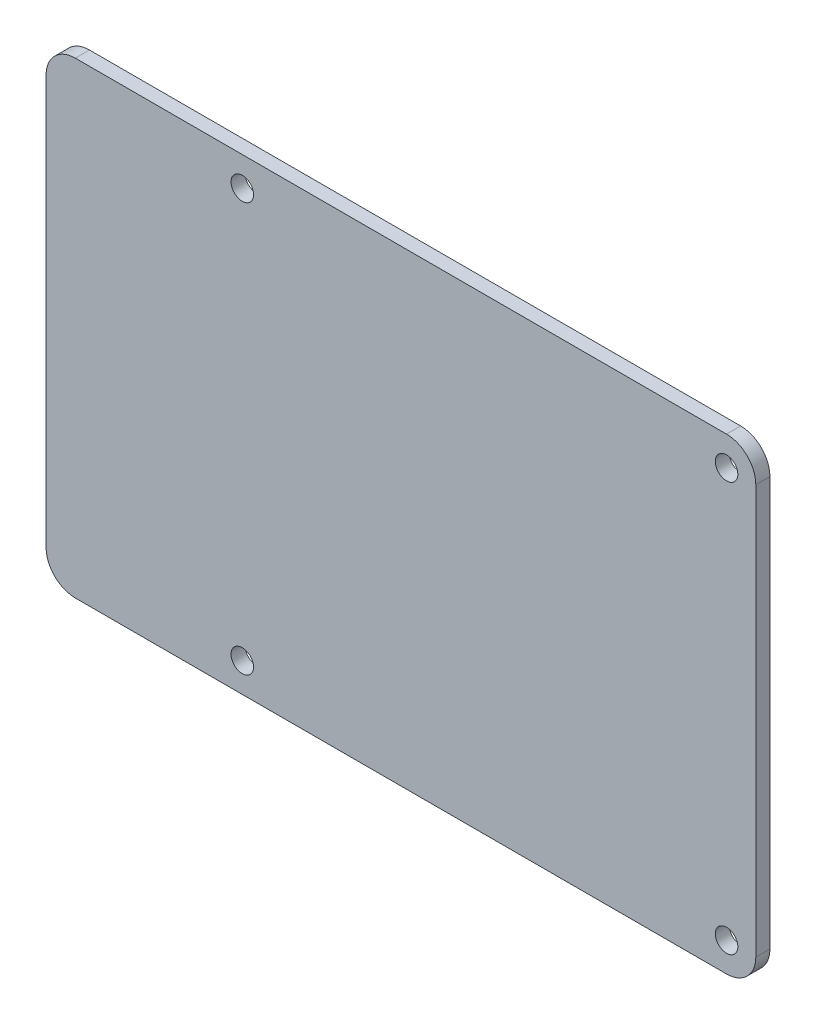
ISO-10303-21;
HEADER;
FILE_DESCRIPTION(('STEP AP214'),'2;1');
FILE_NAME('part.step','',(''),(''),'','','');
FILE_SCHEMA(('AUTOMOTIVE_DESIGN { 1 0 10303 214 1 1 1 1 }'));
ENDSEC;
DATA;
#1=APPLICATION_CONTEXT('core data for automotive mechanical design processes');
#2=APPLICATION_PROTOCOL_DEFINITION('international standard','automotive_design',2000,#1);
#3=PRODUCT_CONTEXT('',#1,'mechanical');
#4=PRODUCT('Part','Part','',(#3));
#5=PRODUCT_RELATED_PRODUCT_CATEGORY('part','',(#4));
#6=PRODUCT_DEFINITION_FORMATION('','',#4);
#7=PRODUCT_DEFINITION_CONTEXT('part definition',#1,'design');
#8=PRODUCT_DEFINITION('design','',#6,#7);
#9=PRODUCT_DEFINITION_SHAPE('','',#8);
#10=(LENGTH_UNIT() NAMED_UNIT(*) SI_UNIT(.MILLI.,.METRE.));
#11=(NAMED_UNIT(*) PLANE_ANGLE_UNIT() SI_UNIT($,.RADIAN.));
#12=(NAMED_UNIT(*) SI_UNIT($,.STERADIAN.) SOLID_ANGLE_UNIT());
#13=UNCERTAINTY_MEASURE_WITH_UNIT(LENGTH_MEASURE(1.E-05),#10,'distance_accuracy_value','');
#14=(GEOMETRIC_REPRESENTATION_CONTEXT(3) GLOBAL_UNCERTAINTY_ASSIGNED_CONTEXT((#13)) GLOBAL_UNIT_ASSIGNED_CONTEXT((#10,
#11,#12)) REPRESENTATION_CONTEXT('',''));
#15=CARTESIAN_POINT('',(0.,0.,0.));
#16=DIRECTION('',(0.,0.,1.));
#17=DIRECTION('',(1.,0.,0.));
#18=AXIS2_PLACEMENT_3D('',#15,#16,#17);
#19=CARTESIAN_POINT('',(-0.001000000047498,3.5,0.));
#20=DIRECTION('',(0.,0.,-1.));
#21=DIRECTION('',(-1.,0.,0.));
#22=AXIS2_PLACEMENT_3D('',#19,#20,#21);
#23=PLANE('',#22);
#24=DIRECTION('',(-1.,0.,0.));
#25=VECTOR('',#24,1.);
#26=CARTESIAN_POINT('',(-0.001000000047498,0.,0.));
#27=LINE('',#26,#25);
#28=CARTESIAN_POINT('',(3.499000072479,2.54570670099596E-13,0.));
#29=VERTEX_POINT('',#28);
#30=CARTESIAN_POINT('',(81.499000549316,0.,0.));
#31=VERTEX_POINT('',#30);
#32=EDGE_CURVE('E125',#29,#31,#27,.F.);
#33=ORIENTED_EDGE('',*,*,#32,.T.);
#34=CARTESIAN_POINT('',(81.499429020422,3.499571528894,0.));
#35=DIRECTION('',(0.,0.,-1.));
#36=DIRECTION('',(-1.,0.,0.));
#37=AXIS2_PLACEMENT_3D('',#34,#35,#36);
#38=CIRCLE('',#37,3.499571555124);
#39=CARTESIAN_POINT('',(84.999000549316,3.5,0.));
#40=VERTEX_POINT('',#39);
#41=EDGE_CURVE('E128',#40,#31,#38,.T.);
#42=ORIENTED_EDGE('',*,*,#41,.F.);
#43=DIRECTION('',(0.,1.,0.));
#44=VECTOR('',#43,1.);
#45=CARTESIAN_POINT('',(84.999000549316,3.5,0.));
#46=LINE('',#45,#44);
#47=CARTESIAN_POINT('',(84.999000549316,52.5,0.));
#48=VERTEX_POINT('',#47);
#49=EDGE_CURVE('E132',#40,#48,#46,.T.);
#50=ORIENTED_EDGE('',*,*,#49,.T.);
#51=CARTESIAN_POINT('',(81.499426375662,52.500425826346,0.));
#52=DIRECTION('',(0.,0.,-1.));
#53=DIRECTION('',(-1.,0.,0.));
#54=AXIS2_PLACEMENT_3D('',#51,#52,#53);
#55=CIRCLE('',#54,3.499574199561);
#56=CARTESIAN_POINT('',(81.499000549316,55.9999999999999,0.));
#57=VERTEX_POINT('',#56);
#58=EDGE_CURVE('E135',#57,#48,#55,.T.);
#59=ORIENTED_EDGE('',*,*,#58,.F.);
#60=DIRECTION('',(-1.,0.,0.));
#61=VECTOR('',#60,1.);
#62=CARTESIAN_POINT('',(-0.001000000047498,56.,0.));
#63=LINE('',#62,#61);
#64=CARTESIAN_POINT('',(3.499000072479,56.,0.));
#65=VERTEX_POINT('',#64);
#66=EDGE_CURVE('E94',#57,#65,#63,.T.);
#67=ORIENTED_EDGE('',*,*,#66,.T.);
#68=CARTESIAN_POINT('',(3.498571652636,52.500428347325,0.));
#69=DIRECTION('',(0.,0.,-1.));
#70=DIRECTION('',(-1.,0.,0.));
#71=AXIS2_PLACEMENT_3D('',#68,#69,#70);
#72=CIRCLE('',#71,3.499571678899);
#73=CARTESIAN_POINT('',(-0.00100000004782833,52.5,0.));
#74=VERTEX_POINT('',#73);
#75=EDGE_CURVE('E91',#74,#65,#72,.T.);
#76=ORIENTED_EDGE('',*,*,#75,.F.);
#77=DIRECTION('',(0.,1.,0.));
#78=VECTOR('',#77,1.);
#79=CARTESIAN_POINT('',(-0.001000000047498,3.5,0.));
#80=LINE('',#79,#78);
#81=CARTESIAN_POINT('',(-0.00100000004745992,3.5,0.));
#82=VERTEX_POINT('',#81);
#83=EDGE_CURVE('E20',#74,#82,#80,.F.);
#84=ORIENTED_EDGE('',*,*,#83,.T.);
#85=CARTESIAN_POINT('',(3.498569007882,3.499569007921,0.));
#86=DIRECTION('',(0.,0.,-1.));
#87=DIRECTION('',(-1.,0.,0.));
#88=AXIS2_PLACEMENT_3D('',#85,#86,#87);
#89=CIRCLE('',#88,3.499569034469);
#90=EDGE_CURVE('E123',#29,#82,#89,.T.);
#91=ORIENTED_EDGE('',*,*,#90,.F.);
#92=EDGE_LOOP('',(#33,#42,#50,#59,#67,#76,#84,#91));
#93=FACE_BOUND('',#92,.T.);
#94=CARTESIAN_POINT('',(81.499000549316,3.5,0.));
#95=DIRECTION('',(0.,0.,1.));
#96=DIRECTION('',(1.,0.,0.));
#97=AXIS2_PLACEMENT_3D('',#94,#95,#96);
#98=CIRCLE('',#97,1.35000000000001);
#99=CARTESIAN_POINT('',(82.849000549316,3.5,0.));
#100=VERTEX_POINT('',#99);
#101=EDGE_CURVE('E152',#100,#100,#98,.T.);
#102=ORIENTED_EDGE('',*,*,#101,.F.);
#103=EDGE_LOOP('',(#102));
#104=FACE_BOUND('',#103,.T.);
#105=CARTESIAN_POINT('',(23.499000549316,3.49999999999959,0.));
#106=DIRECTION('',(0.,0.,1.));
#107=DIRECTION('',(1.,0.,0.));
#108=AXIS2_PLACEMENT_3D('',#105,#106,#107);
#109=CIRCLE('',#108,1.35000000000001);
#110=CARTESIAN_POINT('',(24.849000549316,3.49999999999959,0.));
#111=VERTEX_POINT('',#110);
#112=EDGE_CURVE('E158',#111,#111,#109,.T.);
#113=ORIENTED_EDGE('',*,*,#112,.F.);
#114=EDGE_LOOP('',(#113));
#115=FACE_BOUND('',#114,.T.);
#116=CARTESIAN_POINT('',(23.4990005493158,52.4999999999996,0.));
#117=DIRECTION('',(0.,0.,1.));
#118=DIRECTION('',(1.,0.,0.));
#119=AXIS2_PLACEMENT_3D('',#116,#117,#118);
#120=CIRCLE('',#119,1.35);
#121=CARTESIAN_POINT('',(24.8490005493158,52.4999999999996,0.));
#122=VERTEX_POINT('',#121);
#123=EDGE_CURVE('E164',#122,#122,#120,.T.);
#124=ORIENTED_EDGE('',*,*,#123,.F.);
#125=EDGE_LOOP('',(#124));
#126=FACE_BOUND('',#125,.T.);
#127=CARTESIAN_POINT('',(81.4990005493158,52.5,0.));
#128=DIRECTION('',(0.,0.,1.));
#129=DIRECTION('',(1.,0.,0.));
#130=AXIS2_PLACEMENT_3D('',#127,#128,#129);
#131=CIRCLE('',#130,1.35);
#132=CARTESIAN_POINT('',(82.8490005493158,52.5,0.));
#133=VERTEX_POINT('',#132);
#134=EDGE_CURVE('E170',#133,#133,#131,.T.);
#135=ORIENTED_EDGE('',*,*,#134,.F.);
#136=EDGE_LOOP('',(#135));
#137=FACE_BOUND('',#136,.T.);
#138=ADVANCED_FACE('F17',(#93,#104,#115,#126,#137),#23,.F.);
#139=CARTESIAN_POINT('',(-0.001000000047497,52.5,-1.69143934));
#140=DIRECTION('',(1.,0.,0.));
#141=DIRECTION('',(0.,0.,-1.));
#142=AXIS2_PLACEMENT_3D('',#139,#140,#141);
#143=PLANE('',#142);
#144=DIRECTION('',(0.,0.,-1.));
#145=VECTOR('',#144,1.);
#146=CARTESIAN_POINT('',(-0.00100000004742183,3.5,-1.69143934));
#147=LINE('',#146,#145);
#148=CARTESIAN_POINT('',(-0.00100000004745992,3.5,-1.69143934));
#149=VERTEX_POINT('',#148);
#150=EDGE_CURVE('E85',#82,#149,#147,.T.);
#151=ORIENTED_EDGE('',*,*,#150,.F.);
#152=ORIENTED_EDGE('',*,*,#83,.F.);
#153=DIRECTION('',(0.,0.,-1.));
#154=VECTOR('',#153,1.);
#155=CARTESIAN_POINT('',(-0.00100000004815866,52.5,-1.69143934));
#156=LINE('',#155,#154);
#157=CARTESIAN_POINT('',(-0.00100000004799349,52.5,-1.69143934));
#158=VERTEX_POINT('',#157);
#159=EDGE_CURVE('E82',#158,#74,#156,.F.);
#160=ORIENTED_EDGE('',*,*,#159,.F.);
#161=DIRECTION('',(0.,1.,0.));
#162=VECTOR('',#161,1.);
#163=CARTESIAN_POINT('',(-0.001000000047498,3.5,-1.69143934));
#164=LINE('',#163,#162);
#165=EDGE_CURVE('E121',#149,#158,#164,.T.);
#166=ORIENTED_EDGE('',*,*,#165,.F.);
#167=EDGE_LOOP('',(#151,#152,#160,#166));
#168=FACE_BOUND('',#167,.T.);
#169=ADVANCED_FACE('F80',(#168),#143,.F.);
#170=CARTESIAN_POINT('',(3.498571652636,52.500428347325,-1.69143934));
#171=DIRECTION('',(0.,0.,-1.));
#172=DIRECTION('',(-1.,0.,0.));
#173=AXIS2_PLACEMENT_3D('',#170,#171,#172);
#174=CYLINDRICAL_SURFACE('',#173,3.499571678899);
#175=ORIENTED_EDGE('',*,*,#75,.T.);
#176=DIRECTION('',(0.,0.,-1.));
#177=VECTOR('',#176,1.);
#178=CARTESIAN_POINT('',(3.499000072479,56.,-1.69143934));
#179=LINE('',#178,#177);
#180=CARTESIAN_POINT('',(3.499000072479,56.,-1.69143934));
#181=VERTEX_POINT('',#180);
#182=EDGE_CURVE('E103',#65,#181,#179,.T.);
#183=ORIENTED_EDGE('',*,*,#182,.T.);
#184=CARTESIAN_POINT('',(3.498571652636,52.500428347325,-1.69143934));
#185=DIRECTION('',(0.,0.,-1.));
#186=DIRECTION('',(-1.,0.,0.));
#187=AXIS2_PLACEMENT_3D('',#184,#185,#186);
#188=CIRCLE('',#187,3.499571678899);
#189=EDGE_CURVE('E99',#158,#181,#188,.T.);
#190=ORIENTED_EDGE('',*,*,#189,.F.);
#191=ORIENTED_EDGE('',*,*,#159,.T.);
#192=EDGE_LOOP('',(#175,#183,#190,#191));
#193=FACE_BOUND('',#192,.T.);
#194=ADVANCED_FACE('F97',(#193),#174,.T.);
#195=CARTESIAN_POINT('',(81.499000549316,56.,-1.69143934));
#196=DIRECTION('',(0.,-1.,0.));
#197=DIRECTION('',(0.,0.,-1.));
#198=AXIS2_PLACEMENT_3D('',#195,#196,#197);
#199=PLANE('',#198);
#200=ORIENTED_EDGE('',*,*,#182,.F.);
#201=ORIENTED_EDGE('',*,*,#66,.F.);
#202=DIRECTION('',(0.,0.,-1.));
#203=VECTOR('',#202,1.);
#204=CARTESIAN_POINT('',(81.499000549316,55.9999999999998,-1.69143934));
#205=LINE('',#204,#203);
#206=CARTESIAN_POINT('',(81.499000549316,55.9999999999999,-1.69143934));
#207=VERTEX_POINT('',#206);
#208=EDGE_CURVE('E138',#207,#57,#205,.F.);
#209=ORIENTED_EDGE('',*,*,#208,.F.);
#210=DIRECTION('',(-1.,0.,0.));
#211=VECTOR('',#210,1.);
#212=CARTESIAN_POINT('',(-0.001000000047498,56.,-1.69143934));
#213=LINE('',#212,#211);
#214=EDGE_CURVE('E117',#181,#207,#213,.F.);
#215=ORIENTED_EDGE('',*,*,#214,.F.);
#216=EDGE_LOOP('',(#200,#201,#209,#215));
#217=FACE_BOUND('',#216,.T.);
#218=ADVANCED_FACE('F214',(#217),#199,.F.);
#219=CARTESIAN_POINT('',(81.499426375662,52.500425826346,-1.69143934));
#220=DIRECTION('',(0.,0.,-1.));
#221=DIRECTION('',(-1.,0.,0.));
#222=AXIS2_PLACEMENT_3D('',#219,#220,#221);
#223=CYLINDRICAL_SURFACE('',#222,3.499574199561);
#224=ORIENTED_EDGE('',*,*,#58,.T.);
#225=DIRECTION('',(0.,0.,1.));
#226=VECTOR('',#225,1.);
#227=CARTESIAN_POINT('',(84.999000549316,52.5,-1.69143934));
#228=LINE('',#227,#226);
#229=CARTESIAN_POINT('',(84.999000549316,52.5,-1.69143934));
#230=VERTEX_POINT('',#229);
#231=EDGE_CURVE('E134',#48,#230,#228,.F.);
#232=ORIENTED_EDGE('',*,*,#231,.T.);
#233=CARTESIAN_POINT('',(81.499426375662,52.500425826346,-1.69143934));
#234=DIRECTION('',(0.,0.,-1.));
#235=DIRECTION('',(-1.,0.,0.));
#236=AXIS2_PLACEMENT_3D('',#233,#234,#235);
#237=CIRCLE('',#236,3.499574199561);
#238=EDGE_CURVE('E114',#207,#230,#237,.T.);
#239=ORIENTED_EDGE('',*,*,#238,.F.);
#240=ORIENTED_EDGE('',*,*,#208,.T.);
#241=EDGE_LOOP('',(#224,#232,#239,#240));
#242=FACE_BOUND('',#241,.T.);
#243=ADVANCED_FACE('F210',(#242),#223,.T.);
#244=CARTESIAN_POINT('',(84.999000549316,3.5,-1.69143934));
#245=DIRECTION('',(-1.,0.,0.));
#246=DIRECTION('',(0.,0.,1.));
#247=AXIS2_PLACEMENT_3D('',#244,#245,#246);
#248=PLANE('',#247);
#249=ORIENTED_EDGE('',*,*,#231,.F.);
#250=ORIENTED_EDGE('',*,*,#49,.F.);
#251=DIRECTION('',(0.,0.,-1.));
#252=VECTOR('',#251,1.);
#253=CARTESIAN_POINT('',(84.999000549316,3.5,-1.69143934));
#254=LINE('',#253,#252);
#255=CARTESIAN_POINT('',(84.999000549316,3.5,-1.69143934));
#256=VERTEX_POINT('',#255);
#257=EDGE_CURVE('E131',#256,#40,#254,.F.);
#258=ORIENTED_EDGE('',*,*,#257,.F.);
#259=DIRECTION('',(0.,1.,0.));
#260=VECTOR('',#259,1.);
#261=CARTESIAN_POINT('',(84.999000549316,3.5,-1.69143934));
#262=LINE('',#261,#260);
#263=EDGE_CURVE('E111',#230,#256,#262,.F.);
#264=ORIENTED_EDGE('',*,*,#263,.F.);
#265=EDGE_LOOP('',(#249,#250,#258,#264));
#266=FACE_BOUND('',#265,.T.);
#267=ADVANCED_FACE('F206',(#266),#248,.F.);
#268=CARTESIAN_POINT('',(81.499429020422,3.499571528894,-1.69143934));
#269=DIRECTION('',(0.,0.,-1.));
#270=DIRECTION('',(-1.,0.,0.));
#271=AXIS2_PLACEMENT_3D('',#268,#269,#270);
#272=CYLINDRICAL_SURFACE('',#271,3.499571555124);
#273=ORIENTED_EDGE('',*,*,#41,.T.);
#274=DIRECTION('',(0.,0.,1.));
#275=VECTOR('',#274,1.);
#276=CARTESIAN_POINT('',(81.499000549316,0.,-1.69143934));
#277=LINE('',#276,#275);
#278=CARTESIAN_POINT('',(81.499000549316,0.,-1.69143934));
#279=VERTEX_POINT('',#278);
#280=EDGE_CURVE('E127',#31,#279,#277,.F.);
#281=ORIENTED_EDGE('',*,*,#280,.T.);
#282=CARTESIAN_POINT('',(81.499429020422,3.499571528894,-1.69143934));
#283=DIRECTION('',(0.,0.,-1.));
#284=DIRECTION('',(-1.,0.,0.));
#285=AXIS2_PLACEMENT_3D('',#282,#283,#284);
#286=CIRCLE('',#285,3.499571555124);
#287=EDGE_CURVE('E108',#256,#279,#286,.T.);
#288=ORIENTED_EDGE('',*,*,#287,.F.);
#289=ORIENTED_EDGE('',*,*,#257,.T.);
#290=EDGE_LOOP('',(#273,#281,#288,#289));
#291=FACE_BOUND('',#290,.T.);
#292=ADVANCED_FACE('F203',(#291),#272,.T.);
#293=CARTESIAN_POINT('',(3.499000072479,0.,-1.69143934));
#294=DIRECTION('',(0.,1.,0.));
#295=DIRECTION('',(0.,0.,1.));
#296=AXIS2_PLACEMENT_3D('',#293,#294,#295);
#297=PLANE('',#296);
#298=ORIENTED_EDGE('',*,*,#280,.F.);
#299=ORIENTED_EDGE('',*,*,#32,.F.);
#300=DIRECTION('',(0.,0.,-1.));
#301=VECTOR('',#300,1.);
#302=CARTESIAN_POINT('',(3.499000072479,5.09575021068187E-13,-1.69143934));
#303=LINE('',#302,#301);
#304=CARTESIAN_POINT('',(3.499000072479,3.82072845583892E-13,-1.69143934));
#305=VERTEX_POINT('',#304);
#306=EDGE_CURVE('E35',#305,#29,#303,.F.);
#307=ORIENTED_EDGE('',*,*,#306,.F.);
#308=DIRECTION('',(-1.,0.,0.));
#309=VECTOR('',#308,1.);
#310=CARTESIAN_POINT('',(-0.001000000047498,0.,-1.69143934));
#311=LINE('',#310,#309);
#312=EDGE_CURVE('E26',#279,#305,#311,.T.);
#313=ORIENTED_EDGE('',*,*,#312,.F.);
#314=EDGE_LOOP('',(#298,#299,#307,#313));
#315=FACE_BOUND('',#314,.T.);
#316=ADVANCED_FACE('F195',(#315),#297,.F.);
#317=CARTESIAN_POINT('',(3.498569007882,3.499569007921,-1.69143934));
#318=DIRECTION('',(0.,0.,-1.));
#319=DIRECTION('',(-1.,0.,0.));
#320=AXIS2_PLACEMENT_3D('',#317,#318,#319);
#321=CYLINDRICAL_SURFACE('',#320,3.499569034469);
#322=ORIENTED_EDGE('',*,*,#90,.T.);
#323=ORIENTED_EDGE('',*,*,#150,.T.);
#324=CARTESIAN_POINT('',(3.498569007882,3.499569007921,-1.69143934));
#325=DIRECTION('',(0.,0.,-1.));
#326=DIRECTION('',(-1.,0.,0.));
#327=AXIS2_PLACEMENT_3D('',#324,#325,#326);
#328=CIRCLE('',#327,3.499569034469);
#329=EDGE_CURVE('E11',#305,#149,#328,.T.);
#330=ORIENTED_EDGE('',*,*,#329,.F.);
#331=ORIENTED_EDGE('',*,*,#306,.T.);
#332=EDGE_LOOP('',(#322,#323,#330,#331));
#333=FACE_BOUND('',#332,.T.);
#334=ADVANCED_FACE('F189',(#333),#321,.T.);
#335=CARTESIAN_POINT('',(-0.001000000047498,3.5,-1.69143934));
#336=DIRECTION('',(0.,0.,-1.));
#337=DIRECTION('',(-1.,0.,0.));
#338=AXIS2_PLACEMENT_3D('',#335,#336,#337);
#339=PLANE('',#338);
#340=ORIENTED_EDGE('',*,*,#312,.T.);
#341=ORIENTED_EDGE('',*,*,#329,.T.);
#342=ORIENTED_EDGE('',*,*,#165,.T.);
#343=ORIENTED_EDGE('',*,*,#189,.T.);
#344=ORIENTED_EDGE('',*,*,#214,.T.);
#345=ORIENTED_EDGE('',*,*,#238,.T.);
#346=ORIENTED_EDGE('',*,*,#263,.T.);
#347=ORIENTED_EDGE('',*,*,#287,.T.);
#348=EDGE_LOOP('',(#340,#341,#342,#343,#344,#345,#346,#347));
#349=FACE_BOUND('',#348,.T.);
#350=CARTESIAN_POINT('',(81.499000549316,3.5,-1.69143934));
#351=DIRECTION('',(0.,0.,-1.));
#352=DIRECTION('',(-1.,0.,0.));
#353=AXIS2_PLACEMENT_3D('',#350,#351,#352);
#354=CIRCLE('',#353,1.35000000000001);
#355=CARTESIAN_POINT('',(82.849000549316,3.5,-1.69143934));
#356=VERTEX_POINT('',#355);
#357=EDGE_CURVE('E89',#356,#356,#354,.F.);
#358=ORIENTED_EDGE('',*,*,#357,.T.);
#359=EDGE_LOOP('',(#358));
#360=FACE_BOUND('',#359,.T.);
#361=CARTESIAN_POINT('',(23.499000549316,3.49999999999959,-1.69143934));
#362=DIRECTION('',(0.,0.,-1.));
#363=DIRECTION('',(-1.,0.,0.));
#364=AXIS2_PLACEMENT_3D('',#361,#362,#363);
#365=CIRCLE('',#364,1.35000000000001);
#366=CARTESIAN_POINT('',(24.849000549316,3.49999999999959,-1.69143934));
#367=VERTEX_POINT('',#366);
#368=EDGE_CURVE('E155',#367,#367,#365,.F.);
#369=ORIENTED_EDGE('',*,*,#368,.T.);
#370=EDGE_LOOP('',(#369));
#371=FACE_BOUND('',#370,.T.);
#372=CARTESIAN_POINT('',(23.4990005493158,52.4999999999996,-1.69143934));
#373=DIRECTION('',(0.,0.,-1.));
#374=DIRECTION('',(-1.,0.,0.));
#375=AXIS2_PLACEMENT_3D('',#372,#373,#374);
#376=CIRCLE('',#375,1.35);
#377=CARTESIAN_POINT('',(24.8490005493158,52.4999999999996,-1.69143934));
#378=VERTEX_POINT('',#377);
#379=EDGE_CURVE('E161',#378,#378,#376,.F.);
#380=ORIENTED_EDGE('',*,*,#379,.T.);
#381=EDGE_LOOP('',(#380));
#382=FACE_BOUND('',#381,.T.);
#383=CARTESIAN_POINT('',(81.4990005493158,52.5,-1.69143934));
#384=DIRECTION('',(0.,0.,-1.));
#385=DIRECTION('',(-1.,0.,0.));
#386=AXIS2_PLACEMENT_3D('',#383,#384,#385);
#387=CIRCLE('',#386,1.35);
#388=CARTESIAN_POINT('',(82.8490005493158,52.5,-1.69143934));
#389=VERTEX_POINT('',#388);
#390=EDGE_CURVE('E167',#389,#389,#387,.F.);
#391=ORIENTED_EDGE('',*,*,#390,.T.);
#392=EDGE_LOOP('',(#391));
#393=FACE_BOUND('',#392,.T.);
#394=ADVANCED_FACE('F185',(#349,#360,#371,#382,#393),#339,.T.);
#395=CARTESIAN_POINT('',(81.499000549316,3.5,-9.46961393305205));
#396=DIRECTION('',(0.,0.,1.));
#397=DIRECTION('',(1.,0.,0.));
#398=AXIS2_PLACEMENT_3D('',#395,#396,#397);
#399=CYLINDRICAL_SURFACE('',#398,1.35000000000001);
#400=CARTESIAN_POINT('',(82.849000549316,3.5,0.));
#401=CARTESIAN_POINT('',(82.849000549316,3.5,-0.0176191597916666));
#402=CARTESIAN_POINT('',(82.849000549316,3.5,-0.0352383195833331));
#403=CARTESIAN_POINT('',(82.849000549316,3.5,-0.0704766391666662));
#404=CARTESIAN_POINT('',(82.849000549316,3.5,-0.0880957989583328));
#405=CARTESIAN_POINT('',(82.849000549316,3.5,-0.123334118541666));
#406=CARTESIAN_POINT('',(82.849000549316,3.5,-0.140953278333334));
#407=CARTESIAN_POINT('',(82.849000549316,3.5,-0.176191597916667));
#408=CARTESIAN_POINT('',(82.849000549316,3.5,-0.193810757708334));
#409=CARTESIAN_POINT('',(82.849000549316,3.5,-0.229049077291667));
#410=CARTESIAN_POINT('',(82.849000549316,3.5,-0.246668237083334));
#411=CARTESIAN_POINT('',(82.849000549316,3.5,-0.281906556666667));
#412=CARTESIAN_POINT('',(82.849000549316,3.5,-0.299525716458333));
#413=CARTESIAN_POINT('',(82.849000549316,3.5,-0.334764036041666));
#414=CARTESIAN_POINT('',(82.849000549316,3.5,-0.352383195833333));
#415=CARTESIAN_POINT('',(82.849000549316,3.5,-0.387621515416667));
#416=CARTESIAN_POINT('',(82.849000549316,3.5,-0.405240675208334));
#417=CARTESIAN_POINT('',(82.849000549316,3.5,-0.440478994791667));
#418=CARTESIAN_POINT('',(82.849000549316,3.5,-0.458098154583334));
#419=CARTESIAN_POINT('',(82.849000549316,3.5,-0.493336474166667));
#420=CARTESIAN_POINT('',(82.849000549316,3.5,-0.510955633958334));
#421=CARTESIAN_POINT('',(82.849000549316,3.5,-0.546193953541667));
#422=CARTESIAN_POINT('',(82.849000549316,3.5,-0.563813113333333));
#423=CARTESIAN_POINT('',(82.849000549316,3.5,-0.599051432916666));
#424=CARTESIAN_POINT('',(82.849000549316,3.5,-0.616670592708333));
#425=CARTESIAN_POINT('',(82.849000549316,3.5,-0.651908912291666));
#426=CARTESIAN_POINT('',(82.849000549316,3.5,-0.669528072083333));
#427=CARTESIAN_POINT('',(82.849000549316,3.5,-0.704766391666666));
#428=CARTESIAN_POINT('',(82.849000549316,3.5,-0.722385551458333));
#429=CARTESIAN_POINT('',(82.849000549316,3.5,-0.757623871041667));
#430=CARTESIAN_POINT('',(82.849000549316,3.5,-0.775243030833334));
#431=CARTESIAN_POINT('',(82.849000549316,3.5,-0.810481350416667));
#432=CARTESIAN_POINT('',(82.849000549316,3.5,-0.828100510208333));
#433=CARTESIAN_POINT('',(82.849000549316,3.5,-0.863338829791666));
#434=CARTESIAN_POINT('',(82.849000549316,3.5,-0.880957989583333));
#435=CARTESIAN_POINT('',(82.849000549316,3.5,-0.916196309166666));
#436=CARTESIAN_POINT('',(82.849000549316,3.5,-0.933815468958333));
#437=CARTESIAN_POINT('',(82.849000549316,3.5,-0.969053788541666));
#438=CARTESIAN_POINT('',(82.849000549316,3.5,-0.986672948333332));
#439=CARTESIAN_POINT('',(82.849000549316,3.5,-1.02191126791667));
#440=CARTESIAN_POINT('',(82.849000549316,3.5,-1.03953042770833));
#441=CARTESIAN_POINT('',(82.849000549316,3.5,-1.07476874729167));
#442=CARTESIAN_POINT('',(82.849000549316,3.5,-1.09238790708333));
#443=CARTESIAN_POINT('',(82.849000549316,3.5,-1.12762622666667));
#444=CARTESIAN_POINT('',(82.849000549316,3.5,-1.14524538645833));
#445=CARTESIAN_POINT('',(82.849000549316,3.5,-1.18048370604167));
#446=CARTESIAN_POINT('',(82.849000549316,3.5,-1.19810286583333));
#447=CARTESIAN_POINT('',(82.849000549316,3.5,-1.23334118541667));
#448=CARTESIAN_POINT('',(82.849000549316,3.5,-1.25096034520833));
#449=CARTESIAN_POINT('',(82.849000549316,3.5,-1.28619866479167));
#450=CARTESIAN_POINT('',(82.849000549316,3.5,-1.30381782458333));
#451=CARTESIAN_POINT('',(82.849000549316,3.5,-1.33905614416667));
#452=CARTESIAN_POINT('',(82.849000549316,3.5,-1.35667530395833));
#453=CARTESIAN_POINT('',(82.849000549316,3.5,-1.39191362354167));
#454=CARTESIAN_POINT('',(82.849000549316,3.5,-1.40953278333333));
#455=CARTESIAN_POINT('',(82.849000549316,3.5,-1.44477110291667));
#456=CARTESIAN_POINT('',(82.849000549316,3.5,-1.46239026270833));
#457=CARTESIAN_POINT('',(82.849000549316,3.5,-1.49762858229167));
#458=CARTESIAN_POINT('',(82.849000549316,3.5,-1.51524774208333));
#459=CARTESIAN_POINT('',(82.849000549316,3.5,-1.55048606166667));
#460=CARTESIAN_POINT('',(82.849000549316,3.5,-1.56810522145833));
#461=CARTESIAN_POINT('',(82.849000549316,3.5,-1.60334354104167));
#462=CARTESIAN_POINT('',(82.849000549316,3.5,-1.62096270083333));
#463=CARTESIAN_POINT('',(82.849000549316,3.5,-1.65620102041667));
#464=CARTESIAN_POINT('',(82.849000549316,3.5,-1.67382018020833));
#465=CARTESIAN_POINT('',(82.849000549316,3.5,-1.69143934));
#466=B_SPLINE_CURVE_WITH_KNOTS('',3,(#400,#401,#402,#403,#404,#405,#406,#407,#408,#409,#410,
#411,#412,#413,#414,#415,#416,#417,#418,#419,#420,#421,#422,#423,#424,#425,#426,#427,#428,#429,
#430,#431,#432,#433,#434,#435,#436,#437,#438,#439,#440,#441,#442,#443,#444,#445,#446,#447,#448,
#449,#450,#451,#452,#453,#454,#455,#456,#457,#458,#459,#460,#461,#462,#463,#464,#465),
.UNSPECIFIED.,.F.,.F.,(4,2,2,2,2,2,2,2,2,2,2,2,2,2,2,2,2,2,2,2,2,2,2,2,2,2,2,2,2,2,2,2,4),(0.,
0.0528574793749997,0.105714958749999,0.158572438125001,0.2114299175,0.264287396875,
0.31714487625,0.370002355624999,0.422859835000001,0.475717314375,0.52857479375,0.581432273125,
0.6342897525,0.687147231874999,0.740004711250001,0.792862190625,0.84571967,0.898577149375,
0.951434628749999,1.004292108125,1.0571495875,1.110007066875,1.16286454625,1.215722025625,
1.268579505,1.321436984375,1.37429446375,1.427151943125,1.4800094225,1.532866901875,
1.58572438125,1.638581860625,1.69143934),.UNSPECIFIED.);
#467=EDGE_CURVE('BSEAM178',#100,#356,#466,.T.);
#468=ORIENTED_EDGE('',*,*,#101,.T.);
#469=ORIENTED_EDGE('',*,*,#357,.F.);
#470=ORIENTED_EDGE('',*,*,#467,.T.);
#471=ORIENTED_EDGE('',*,*,#467,.F.);
#472=EDGE_LOOP('',(#468,#470,#469,#471));
#473=FACE_BOUND('',#472,.T.);
#474=ADVANCED_FACE('F178',(#473),#399,.F.);
#475=CARTESIAN_POINT('',(23.499000549316,3.49999999999959,-9.46961393305205));
#476=DIRECTION('',(0.,0.,1.));
#477=DIRECTION('',(1.,0.,0.));
#478=AXIS2_PLACEMENT_3D('',#475,#476,#477);
#479=CYLINDRICAL_SURFACE('',#478,1.35000000000001);
#480=CARTESIAN_POINT('',(24.849000549316,3.49999999999959,0.));
#481=CARTESIAN_POINT('',(24.849000549316,3.49999999999959,-0.0176191597916666));
#482=CARTESIAN_POINT('',(24.849000549316,3.49999999999959,-0.0352383195833331));
#483=CARTESIAN_POINT('',(24.849000549316,3.49999999999959,-0.0704766391666662));
#484=CARTESIAN_POINT('',(24.849000549316,3.49999999999959,-0.0880957989583328));
#485=CARTESIAN_POINT('',(24.849000549316,3.49999999999959,-0.123334118541666));
#486=CARTESIAN_POINT('',(24.849000549316,3.49999999999959,-0.140953278333334));
#487=CARTESIAN_POINT('',(24.849000549316,3.49999999999959,-0.176191597916667));
#488=CARTESIAN_POINT('',(24.849000549316,3.49999999999959,-0.193810757708334));
#489=CARTESIAN_POINT('',(24.849000549316,3.49999999999959,-0.229049077291667));
#490=CARTESIAN_POINT('',(24.849000549316,3.49999999999959,-0.246668237083334));
#491=CARTESIAN_POINT('',(24.849000549316,3.49999999999959,-0.281906556666667));
#492=CARTESIAN_POINT('',(24.849000549316,3.49999999999959,-0.299525716458333));
#493=CARTESIAN_POINT('',(24.849000549316,3.49999999999959,-0.334764036041666));
#494=CARTESIAN_POINT('',(24.849000549316,3.49999999999959,-0.352383195833333));
#495=CARTESIAN_POINT('',(24.849000549316,3.49999999999959,-0.387621515416667));
#496=CARTESIAN_POINT('',(24.849000549316,3.49999999999959,-0.405240675208334));
#497=CARTESIAN_POINT('',(24.849000549316,3.49999999999959,-0.440478994791667));
#498=CARTESIAN_POINT('',(24.849000549316,3.49999999999959,-0.458098154583334));
#499=CARTESIAN_POINT('',(24.849000549316,3.49999999999959,-0.493336474166667));
#500=CARTESIAN_POINT('',(24.849000549316,3.49999999999959,-0.510955633958334));
#501=CARTESIAN_POINT('',(24.849000549316,3.49999999999959,-0.546193953541667));
#502=CARTESIAN_POINT('',(24.849000549316,3.49999999999959,-0.563813113333333));
#503=CARTESIAN_POINT('',(24.849000549316,3.49999999999959,-0.599051432916666));
#504=CARTESIAN_POINT('',(24.849000549316,3.49999999999959,-0.616670592708333));
#505=CARTESIAN_POINT('',(24.849000549316,3.49999999999959,-0.651908912291666));
#506=CARTESIAN_POINT('',(24.849000549316,3.49999999999959,-0.669528072083333));
#507=CARTESIAN_POINT('',(24.849000549316,3.49999999999959,-0.704766391666666));
#508=CARTESIAN_POINT('',(24.849000549316,3.49999999999959,-0.722385551458333));
#509=CARTESIAN_POINT('',(24.849000549316,3.49999999999959,-0.757623871041667));
#510=CARTESIAN_POINT('',(24.849000549316,3.49999999999959,-0.775243030833334));
#511=CARTESIAN_POINT('',(24.849000549316,3.49999999999959,-0.810481350416667));
#512=CARTESIAN_POINT('',(24.849000549316,3.49999999999959,-0.828100510208333));
#513=CARTESIAN_POINT('',(24.849000549316,3.49999999999959,-0.863338829791666));
#514=CARTESIAN_POINT('',(24.849000549316,3.49999999999959,-0.880957989583333));
#515=CARTESIAN_POINT('',(24.849000549316,3.49999999999959,-0.916196309166666));
#516=CARTESIAN_POINT('',(24.849000549316,3.49999999999959,-0.933815468958333));
#517=CARTESIAN_POINT('',(24.849000549316,3.49999999999959,-0.969053788541666));
#518=CARTESIAN_POINT('',(24.849000549316,3.49999999999959,-0.986672948333332));
#519=CARTESIAN_POINT('',(24.849000549316,3.49999999999959,-1.02191126791667));
#520=CARTESIAN_POINT('',(24.849000549316,3.49999999999959,-1.03953042770833));
#521=CARTESIAN_POINT('',(24.849000549316,3.49999999999959,-1.07476874729167));
#522=CARTESIAN_POINT('',(24.849000549316,3.49999999999959,-1.09238790708333));
#523=CARTESIAN_POINT('',(24.849000549316,3.49999999999959,-1.12762622666667));
#524=CARTESIAN_POINT('',(24.849000549316,3.49999999999959,-1.14524538645833));
#525=CARTESIAN_POINT('',(24.849000549316,3.49999999999959,-1.18048370604167));
#526=CARTESIAN_POINT('',(24.849000549316,3.49999999999959,-1.19810286583333));
#527=CARTESIAN_POINT('',(24.849000549316,3.49999999999959,-1.23334118541667));
#528=CARTESIAN_POINT('',(24.849000549316,3.49999999999959,-1.25096034520833));
#529=CARTESIAN_POINT('',(24.849000549316,3.49999999999959,-1.28619866479167));
#530=CARTESIAN_POINT('',(24.849000549316,3.49999999999959,-1.30381782458333));
#531=CARTESIAN_POINT('',(24.849000549316,3.49999999999959,-1.33905614416667));
#532=CARTESIAN_POINT('',(24.849000549316,3.49999999999959,-1.35667530395833));
#533=CARTESIAN_POINT('',(24.849000549316,3.49999999999959,-1.39191362354167));
#534=CARTESIAN_POINT('',(24.849000549316,3.49999999999959,-1.40953278333333));
#535=CARTESIAN_POINT('',(24.849000549316,3.49999999999959,-1.44477110291667));
#536=CARTESIAN_POINT('',(24.849000549316,3.49999999999959,-1.46239026270833));
#537=CARTESIAN_POINT('',(24.849000549316,3.49999999999959,-1.49762858229167));
#538=CARTESIAN_POINT('',(24.849000549316,3.49999999999959,-1.51524774208333));
#539=CARTESIAN_POINT('',(24.849000549316,3.49999999999959,-1.55048606166667));
#540=CARTESIAN_POINT('',(24.849000549316,3.49999999999959,-1.56810522145833));
#541=CARTESIAN_POINT('',(24.849000549316,3.49999999999959,-1.60334354104167));
#542=CARTESIAN_POINT('',(24.849000549316,3.49999999999959,-1.62096270083333));
#543=CARTESIAN_POINT('',(24.849000549316,3.49999999999959,-1.65620102041667));
#544=CARTESIAN_POINT('',(24.849000549316,3.49999999999959,-1.67382018020833));
#545=CARTESIAN_POINT('',(24.849000549316,3.49999999999959,-1.69143934));
#546=B_SPLINE_CURVE_WITH_KNOTS('',3,(#480,#481,#482,#483,#484,#485,#486,#487,#488,#489,#490,
#491,#492,#493,#494,#495,#496,#497,#498,#499,#500,#501,#502,#503,#504,#505,#506,#507,#508,#509,
#510,#511,#512,#513,#514,#515,#516,#517,#518,#519,#520,#521,#522,#523,#524,#525,#526,#527,#528,
#529,#530,#531,#532,#533,#534,#535,#536,#537,#538,#539,#540,#541,#542,#543,#544,#545),
.UNSPECIFIED.,.F.,.F.,(4,2,2,2,2,2,2,2,2,2,2,2,2,2,2,2,2,2,2,2,2,2,2,2,2,2,2,2,2,2,2,2,4),(0.,
0.0528574793749997,0.105714958749999,0.158572438125001,0.2114299175,0.264287396875,
0.31714487625,0.370002355624999,0.422859835000001,0.475717314375,0.52857479375,0.581432273125,
0.6342897525,0.687147231874999,0.740004711250001,0.792862190625,0.84571967,0.898577149375,
0.951434628749999,1.004292108125,1.0571495875,1.110007066875,1.16286454625,1.215722025625,
1.268579505,1.321436984375,1.37429446375,1.427151943125,1.4800094225,1.532866901875,
1.58572438125,1.638581860625,1.69143934),.UNSPECIFIED.);
#547=EDGE_CURVE('BSEAM184',#111,#367,#546,.T.);
#548=ORIENTED_EDGE('',*,*,#112,.T.);
#549=ORIENTED_EDGE('',*,*,#368,.F.);
#550=ORIENTED_EDGE('',*,*,#547,.T.);
#551=ORIENTED_EDGE('',*,*,#547,.F.);
#552=EDGE_LOOP('',(#548,#550,#549,#551));
#553=FACE_BOUND('',#552,.T.);
#554=ADVANCED_FACE('F184',(#553),#479,.F.);
#555=CARTESIAN_POINT('',(23.4990005493158,52.4999999999996,-9.46961393305205));
#556=DIRECTION('',(0.,0.,1.));
#557=DIRECTION('',(1.,0.,0.));
#558=AXIS2_PLACEMENT_3D('',#555,#556,#557);
#559=CYLINDRICAL_SURFACE('',#558,1.35);
#560=CARTESIAN_POINT('',(24.8490005493158,52.4999999999996,0.));
#561=CARTESIAN_POINT('',(24.8490005493158,52.4999999999996,-0.0176191597916666));
#562=CARTESIAN_POINT('',(24.8490005493158,52.4999999999996,-0.0352383195833331));
#563=CARTESIAN_POINT('',(24.8490005493158,52.4999999999996,-0.0704766391666662));
#564=CARTESIAN_POINT('',(24.8490005493158,52.4999999999996,-0.0880957989583328));
#565=CARTESIAN_POINT('',(24.8490005493158,52.4999999999996,-0.123334118541666));
#566=CARTESIAN_POINT('',(24.8490005493158,52.4999999999996,-0.140953278333334));
#567=CARTESIAN_POINT('',(24.8490005493158,52.4999999999996,-0.176191597916667));
#568=CARTESIAN_POINT('',(24.8490005493158,52.4999999999996,-0.193810757708334));
#569=CARTESIAN_POINT('',(24.8490005493158,52.4999999999996,-0.229049077291667));
#570=CARTESIAN_POINT('',(24.8490005493158,52.4999999999996,-0.246668237083334));
#571=CARTESIAN_POINT('',(24.8490005493158,52.4999999999996,-0.281906556666667));
#572=CARTESIAN_POINT('',(24.8490005493158,52.4999999999996,-0.299525716458333));
#573=CARTESIAN_POINT('',(24.8490005493158,52.4999999999996,-0.334764036041666));
#574=CARTESIAN_POINT('',(24.8490005493158,52.4999999999996,-0.352383195833333));
#575=CARTESIAN_POINT('',(24.8490005493158,52.4999999999996,-0.387621515416667));
#576=CARTESIAN_POINT('',(24.8490005493158,52.4999999999996,-0.405240675208334));
#577=CARTESIAN_POINT('',(24.8490005493158,52.4999999999996,-0.440478994791667));
#578=CARTESIAN_POINT('',(24.8490005493158,52.4999999999996,-0.458098154583334));
#579=CARTESIAN_POINT('',(24.8490005493158,52.4999999999996,-0.493336474166667));
#580=CARTESIAN_POINT('',(24.8490005493158,52.4999999999996,-0.510955633958334));
#581=CARTESIAN_POINT('',(24.8490005493158,52.4999999999996,-0.546193953541667));
#582=CARTESIAN_POINT('',(24.8490005493158,52.4999999999996,-0.563813113333333));
#583=CARTESIAN_POINT('',(24.8490005493158,52.4999999999996,-0.599051432916666));
#584=CARTESIAN_POINT('',(24.8490005493158,52.4999999999996,-0.616670592708333));
#585=CARTESIAN_POINT('',(24.8490005493158,52.4999999999996,-0.651908912291666));
#586=CARTESIAN_POINT('',(24.8490005493158,52.4999999999996,-0.669528072083333));
#587=CARTESIAN_POINT('',(24.8490005493158,52.4999999999996,-0.704766391666666));
#588=CARTESIAN_POINT('',(24.8490005493158,52.4999999999996,-0.722385551458333));
#589=CARTESIAN_POINT('',(24.8490005493158,52.4999999999996,-0.757623871041667));
#590=CARTESIAN_POINT('',(24.8490005493158,52.4999999999996,-0.775243030833334));
#591=CARTESIAN_POINT('',(24.8490005493158,52.4999999999996,-0.810481350416667));
#592=CARTESIAN_POINT('',(24.8490005493158,52.4999999999996,-0.828100510208333));
#593=CARTESIAN_POINT('',(24.8490005493158,52.4999999999996,-0.863338829791666));
#594=CARTESIAN_POINT('',(24.8490005493158,52.4999999999996,-0.880957989583333));
#595=CARTESIAN_POINT('',(24.8490005493158,52.4999999999996,-0.916196309166666));
#596=CARTESIAN_POINT('',(24.8490005493158,52.4999999999996,-0.933815468958333));
#597=CARTESIAN_POINT('',(24.8490005493158,52.4999999999996,-0.969053788541666));
#598=CARTESIAN_POINT('',(24.8490005493158,52.4999999999996,-0.986672948333332));
#599=CARTESIAN_POINT('',(24.8490005493158,52.4999999999996,-1.02191126791667));
#600=CARTESIAN_POINT('',(24.8490005493158,52.4999999999996,-1.03953042770833));
#601=CARTESIAN_POINT('',(24.8490005493158,52.4999999999996,-1.07476874729167));
#602=CARTESIAN_POINT('',(24.8490005493158,52.4999999999996,-1.09238790708333));
#603=CARTESIAN_POINT('',(24.8490005493158,52.4999999999996,-1.12762622666667));
#604=CARTESIAN_POINT('',(24.8490005493158,52.4999999999996,-1.14524538645833));
#605=CARTESIAN_POINT('',(24.8490005493158,52.4999999999996,-1.18048370604167));
#606=CARTESIAN_POINT('',(24.8490005493158,52.4999999999996,-1.19810286583333));
#607=CARTESIAN_POINT('',(24.8490005493158,52.4999999999996,-1.23334118541667));
#608=CARTESIAN_POINT('',(24.8490005493158,52.4999999999996,-1.25096034520833));
#609=CARTESIAN_POINT('',(24.8490005493158,52.4999999999996,-1.28619866479167));
#610=CARTESIAN_POINT('',(24.8490005493158,52.4999999999996,-1.30381782458333));
#611=CARTESIAN_POINT('',(24.8490005493158,52.4999999999996,-1.33905614416667));
#612=CARTESIAN_POINT('',(24.8490005493158,52.4999999999996,-1.35667530395833));
#613=CARTESIAN_POINT('',(24.8490005493158,52.4999999999996,-1.39191362354167));
#614=CARTESIAN_POINT('',(24.8490005493158,52.4999999999996,-1.40953278333333));
#615=CARTESIAN_POINT('',(24.8490005493158,52.4999999999996,-1.44477110291667));
#616=CARTESIAN_POINT('',(24.8490005493158,52.4999999999996,-1.46239026270833));
#617=CARTESIAN_POINT('',(24.8490005493158,52.4999999999996,-1.49762858229167));
#618=CARTESIAN_POINT('',(24.8490005493158,52.4999999999996,-1.51524774208333));
#619=CARTESIAN_POINT('',(24.8490005493158,52.4999999999996,-1.55048606166667));
#620=CARTESIAN_POINT('',(24.8490005493158,52.4999999999996,-1.56810522145833));
#621=CARTESIAN_POINT('',(24.8490005493158,52.4999999999996,-1.60334354104167));
#622=CARTESIAN_POINT('',(24.8490005493158,52.4999999999996,-1.62096270083333));
#623=CARTESIAN_POINT('',(24.8490005493158,52.4999999999996,-1.65620102041667));
#624=CARTESIAN_POINT('',(24.8490005493158,52.4999999999996,-1.67382018020833));
#625=CARTESIAN_POINT('',(24.8490005493158,52.4999999999996,-1.69143934));
#626=B_SPLINE_CURVE_WITH_KNOTS('',3,(#560,#561,#562,#563,#564,#565,#566,#567,#568,#569,#570,
#571,#572,#573,#574,#575,#576,#577,#578,#579,#580,#581,#582,#583,#584,#585,#586,#587,#588,#589,
#590,#591,#592,#593,#594,#595,#596,#597,#598,#599,#600,#601,#602,#603,#604,#605,#606,#607,#608,
#609,#610,#611,#612,#613,#614,#615,#616,#617,#618,#619,#620,#621,#622,#623,#624,#625),
.UNSPECIFIED.,.F.,.F.,(4,2,2,2,2,2,2,2,2,2,2,2,2,2,2,2,2,2,2,2,2,2,2,2,2,2,2,2,2,2,2,2,4),(0.,
0.0528574793749997,0.105714958749999,0.158572438125001,0.2114299175,0.264287396875,
0.31714487625,0.370002355624999,0.422859835000001,0.475717314375,0.52857479375,0.581432273125,
0.6342897525,0.687147231874999,0.740004711250001,0.792862190625,0.84571967,0.898577149375,
0.951434628749999,1.004292108125,1.0571495875,1.110007066875,1.16286454625,1.215722025625,
1.268579505,1.321436984375,1.37429446375,1.427151943125,1.4800094225,1.532866901875,
1.58572438125,1.638581860625,1.69143934),.UNSPECIFIED.);
#627=EDGE_CURVE('BSEAM279',#122,#378,#626,.T.);
#628=ORIENTED_EDGE('',*,*,#123,.T.);
#629=ORIENTED_EDGE('',*,*,#379,.F.);
#630=ORIENTED_EDGE('',*,*,#627,.T.);
#631=ORIENTED_EDGE('',*,*,#627,.F.);
#632=EDGE_LOOP('',(#628,#630,#629,#631));
#633=FACE_BOUND('',#632,.T.);
#634=ADVANCED_FACE('F279',(#633),#559,.F.);
#635=CARTESIAN_POINT('',(81.4990005493158,52.5,-9.46961393305205));
#636=DIRECTION('',(0.,0.,1.));
#637=DIRECTION('',(1.,0.,0.));
#638=AXIS2_PLACEMENT_3D('',#635,#636,#637);
#639=CYLINDRICAL_SURFACE('',#638,1.35);
#640=CARTESIAN_POINT('',(82.8490005493158,52.5,0.));
#641=CARTESIAN_POINT('',(82.8490005493158,52.5,-0.0176191597916666));
#642=CARTESIAN_POINT('',(82.8490005493158,52.5,-0.0352383195833331));
#643=CARTESIAN_POINT('',(82.8490005493158,52.5,-0.0704766391666662));
#644=CARTESIAN_POINT('',(82.8490005493158,52.5,-0.0880957989583328));
#645=CARTESIAN_POINT('',(82.8490005493158,52.5,-0.123334118541666));
#646=CARTESIAN_POINT('',(82.8490005493158,52.5,-0.140953278333334));
#647=CARTESIAN_POINT('',(82.8490005493158,52.5,-0.176191597916667));
#648=CARTESIAN_POINT('',(82.8490005493158,52.5,-0.193810757708334));
#649=CARTESIAN_POINT('',(82.8490005493158,52.5,-0.229049077291667));
#650=CARTESIAN_POINT('',(82.8490005493158,52.5,-0.246668237083334));
#651=CARTESIAN_POINT('',(82.8490005493158,52.5,-0.281906556666667));
#652=CARTESIAN_POINT('',(82.8490005493158,52.5,-0.299525716458333));
#653=CARTESIAN_POINT('',(82.8490005493158,52.5,-0.334764036041666));
#654=CARTESIAN_POINT('',(82.8490005493158,52.5,-0.352383195833333));
#655=CARTESIAN_POINT('',(82.8490005493158,52.5,-0.387621515416667));
#656=CARTESIAN_POINT('',(82.8490005493158,52.5,-0.405240675208334));
#657=CARTESIAN_POINT('',(82.8490005493158,52.5,-0.440478994791667));
#658=CARTESIAN_POINT('',(82.8490005493158,52.5,-0.458098154583334));
#659=CARTESIAN_POINT('',(82.8490005493158,52.5,-0.493336474166667));
#660=CARTESIAN_POINT('',(82.8490005493158,52.5,-0.510955633958334));
#661=CARTESIAN_POINT('',(82.8490005493158,52.5,-0.546193953541667));
#662=CARTESIAN_POINT('',(82.8490005493158,52.5,-0.563813113333333));
#663=CARTESIAN_POINT('',(82.8490005493158,52.5,-0.599051432916666));
#664=CARTESIAN_POINT('',(82.8490005493158,52.5,-0.616670592708333));
#665=CARTESIAN_POINT('',(82.8490005493158,52.5,-0.651908912291666));
#666=CARTESIAN_POINT('',(82.8490005493158,52.5,-0.669528072083333));
#667=CARTESIAN_POINT('',(82.8490005493158,52.5,-0.704766391666666));
#668=CARTESIAN_POINT('',(82.8490005493158,52.5,-0.722385551458333));
#669=CARTESIAN_POINT('',(82.8490005493158,52.5,-0.757623871041667));
#670=CARTESIAN_POINT('',(82.8490005493158,52.5,-0.775243030833334));
#671=CARTESIAN_POINT('',(82.8490005493158,52.5,-0.810481350416667));
#672=CARTESIAN_POINT('',(82.8490005493158,52.5,-0.828100510208333));
#673=CARTESIAN_POINT('',(82.8490005493158,52.5,-0.863338829791666));
#674=CARTESIAN_POINT('',(82.8490005493158,52.5,-0.880957989583333));
#675=CARTESIAN_POINT('',(82.8490005493158,52.5,-0.916196309166666));
#676=CARTESIAN_POINT('',(82.8490005493158,52.5,-0.933815468958333));
#677=CARTESIAN_POINT('',(82.8490005493158,52.5,-0.969053788541666));
#678=CARTESIAN_POINT('',(82.8490005493158,52.5,-0.986672948333332));
#679=CARTESIAN_POINT('',(82.8490005493158,52.5,-1.02191126791667));
#680=CARTESIAN_POINT('',(82.8490005493158,52.5,-1.03953042770833));
#681=CARTESIAN_POINT('',(82.8490005493158,52.5,-1.07476874729167));
#682=CARTESIAN_POINT('',(82.8490005493158,52.5,-1.09238790708333));
#683=CARTESIAN_POINT('',(82.8490005493158,52.5,-1.12762622666667));
#684=CARTESIAN_POINT('',(82.8490005493158,52.5,-1.14524538645833));
#685=CARTESIAN_POINT('',(82.8490005493158,52.5,-1.18048370604167));
#686=CARTESIAN_POINT('',(82.8490005493158,52.5,-1.19810286583333));
#687=CARTESIAN_POINT('',(82.8490005493158,52.5,-1.23334118541667));
#688=CARTESIAN_POINT('',(82.8490005493158,52.5,-1.25096034520833));
#689=CARTESIAN_POINT('',(82.8490005493158,52.5,-1.28619866479167));
#690=CARTESIAN_POINT('',(82.8490005493158,52.5,-1.30381782458333));
#691=CARTESIAN_POINT('',(82.8490005493158,52.5,-1.33905614416667));
#692=CARTESIAN_POINT('',(82.8490005493158,52.5,-1.35667530395833));
#693=CARTESIAN_POINT('',(82.8490005493158,52.5,-1.39191362354167));
#694=CARTESIAN_POINT('',(82.8490005493158,52.5,-1.40953278333333));
#695=CARTESIAN_POINT('',(82.8490005493158,52.5,-1.44477110291667));
#696=CARTESIAN_POINT('',(82.8490005493158,52.5,-1.46239026270833));
#697=CARTESIAN_POINT('',(82.8490005493158,52.5,-1.49762858229167));
#698=CARTESIAN_POINT('',(82.8490005493158,52.5,-1.51524774208333));
#699=CARTESIAN_POINT('',(82.8490005493158,52.5,-1.55048606166667));
#700=CARTESIAN_POINT('',(82.8490005493158,52.5,-1.56810522145833));
#701=CARTESIAN_POINT('',(82.8490005493158,52.5,-1.60334354104167));
#702=CARTESIAN_POINT('',(82.8490005493158,52.5,-1.62096270083333));
#703=CARTESIAN_POINT('',(82.8490005493158,52.5,-1.65620102041667));
#704=CARTESIAN_POINT('',(82.8490005493158,52.5,-1.67382018020833));
#705=CARTESIAN_POINT('',(82.8490005493158,52.5,-1.69143934));
#706=B_SPLINE_CURVE_WITH_KNOTS('',3,(#640,#641,#642,#643,#644,#645,#646,#647,#648,#649,#650,
#651,#652,#653,#654,#655,#656,#657,#658,#659,#660,#661,#662,#663,#664,#665,#666,#667,#668,#669,
#670,#671,#672,#673,#674,#675,#676,#677,#678,#679,#680,#681,#682,#683,#684,#685,#686,#687,#688,
#689,#690,#691,#692,#693,#694,#695,#696,#697,#698,#699,#700,#701,#702,#703,#704,#705),
.UNSPECIFIED.,.F.,.F.,(4,2,2,2,2,2,2,2,2,2,2,2,2,2,2,2,2,2,2,2,2,2,2,2,2,2,2,2,2,2,2,2,4),(0.,
0.0528574793749997,0.105714958749999,0.158572438125001,0.2114299175,0.264287396875,
0.31714487625,0.370002355624999,0.422859835000001,0.475717314375,0.52857479375,0.581432273125,
0.6342897525,0.687147231874999,0.740004711250001,0.792862190625,0.84571967,0.898577149375,
0.951434628749999,1.004292108125,1.0571495875,1.110007066875,1.16286454625,1.215722025625,
1.268579505,1.321436984375,1.37429446375,1.427151943125,1.4800094225,1.532866901875,
1.58572438125,1.638581860625,1.69143934),.UNSPECIFIED.);
#707=EDGE_CURVE('BSEAM174',#133,#389,#706,.T.);
#708=ORIENTED_EDGE('',*,*,#134,.T.);
#709=ORIENTED_EDGE('',*,*,#390,.F.);
#710=ORIENTED_EDGE('',*,*,#707,.T.);
#711=ORIENTED_EDGE('',*,*,#707,.F.);
#712=EDGE_LOOP('',(#708,#710,#709,#711));
#713=FACE_BOUND('',#712,.T.);
#714=ADVANCED_FACE('F174',(#713),#639,.F.);
#715=CLOSED_SHELL('',(#138,#169,#194,#218,#243,#267,#292,#316,#334,#394,#474,#554,#634,#714));
#716=MANIFOLD_SOLID_BREP('B1',#715);
#717=ADVANCED_BREP_SHAPE_REPRESENTATION('',(#18,#716),#14);
#718=SHAPE_DEFINITION_REPRESENTATION(#9,#717);
ENDSEC;
END-ISO-10303-21;
